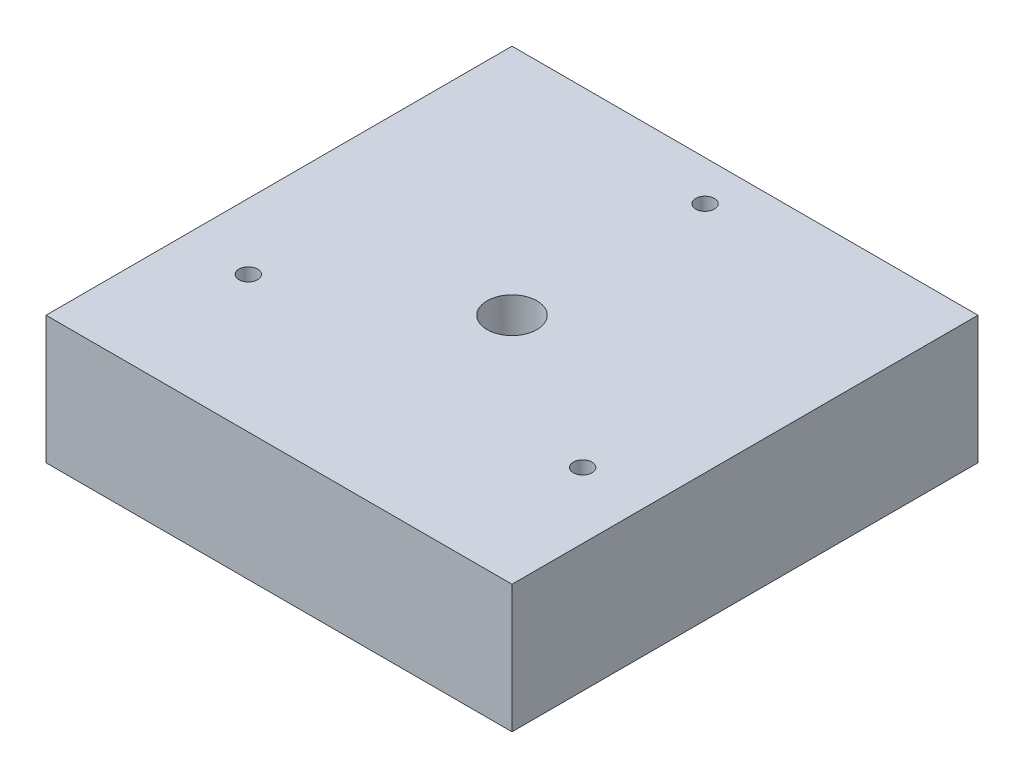
ISO-10303-21;
HEADER;
FILE_DESCRIPTION(('STEP AP214'),'2;1');
FILE_NAME('part.step','',(''),(''),'','','');
FILE_SCHEMA(('AUTOMOTIVE_DESIGN { 1 0 10303 214 1 1 1 1 }'));
ENDSEC;
DATA;
#1=APPLICATION_CONTEXT('core data for automotive mechanical design processes');
#2=APPLICATION_PROTOCOL_DEFINITION('international standard','automotive_design',2000,#1);
#3=PRODUCT_CONTEXT('',#1,'mechanical');
#4=PRODUCT('Part','Part','',(#3));
#5=PRODUCT_RELATED_PRODUCT_CATEGORY('part','',(#4));
#6=PRODUCT_DEFINITION_FORMATION('','',#4);
#7=PRODUCT_DEFINITION_CONTEXT('part definition',#1,'design');
#8=PRODUCT_DEFINITION('design','',#6,#7);
#9=PRODUCT_DEFINITION_SHAPE('','',#8);
#10=(LENGTH_UNIT() NAMED_UNIT(*) SI_UNIT(.MILLI.,.METRE.));
#11=(NAMED_UNIT(*) PLANE_ANGLE_UNIT() SI_UNIT($,.RADIAN.));
#12=(NAMED_UNIT(*) SI_UNIT($,.STERADIAN.) SOLID_ANGLE_UNIT());
#13=UNCERTAINTY_MEASURE_WITH_UNIT(LENGTH_MEASURE(1.E-05),#10,'distance_accuracy_value','');
#14=(GEOMETRIC_REPRESENTATION_CONTEXT(3) GLOBAL_UNCERTAINTY_ASSIGNED_CONTEXT((#13)) GLOBAL_UNIT_ASSIGNED_CONTEXT((#10,
#11,#12)) REPRESENTATION_CONTEXT('',''));
#15=CARTESIAN_POINT('',(0.,0.,0.));
#16=DIRECTION('',(0.,0.,1.));
#17=DIRECTION('',(1.,0.,0.));
#18=AXIS2_PLACEMENT_3D('',#15,#16,#17);
#19=CARTESIAN_POINT('',(0.,3.937,0.));
#20=DIRECTION('',(0.,-1.,0.));
#21=DIRECTION('',(0.,0.,-1.));
#22=AXIS2_PLACEMENT_3D('',#19,#20,#21);
#23=PLANE('',#22);
#24=CARTESIAN_POINT('',(15.9478578106904,3.937,9.2075));
#25=DIRECTION('',(0.,1.,0.));
#26=DIRECTION('',(0.,0.,1.));
#27=AXIS2_PLACEMENT_3D('',#24,#25,#26);
#28=CIRCLE('',#27,0.888999999999987);
#29=CARTESIAN_POINT('',(15.9478578106904,3.937,10.0965));
#30=VERTEX_POINT('',#29);
#31=EDGE_CURVE('E104',#30,#30,#28,.T.);
#32=ORIENTED_EDGE('',*,*,#31,.F.);
#33=EDGE_LOOP('',(#32));
#34=FACE_BOUND('',#33,.T.);
#35=CARTESIAN_POINT('',(-15.9478578106904,3.937,9.2075));
#36=DIRECTION('',(0.,1.,0.));
#37=DIRECTION('',(0.,0.,1.));
#38=AXIS2_PLACEMENT_3D('',#35,#36,#37);
#39=CIRCLE('',#38,0.888999999999989);
#40=CARTESIAN_POINT('',(-15.9478578106904,3.937,10.0965));
#41=VERTEX_POINT('',#40);
#42=EDGE_CURVE('E103',#41,#41,#39,.T.);
#43=ORIENTED_EDGE('',*,*,#42,.F.);
#44=EDGE_LOOP('',(#43));
#45=FACE_BOUND('',#44,.T.);
#46=CARTESIAN_POINT('',(0.,3.937,-18.415));
#47=DIRECTION('',(0.,1.,0.));
#48=DIRECTION('',(0.,0.,1.));
#49=AXIS2_PLACEMENT_3D('',#46,#47,#48);
#50=CIRCLE('',#49,0.888999999999989);
#51=CARTESIAN_POINT('',(0.,3.937,-17.526));
#52=VERTEX_POINT('',#51);
#53=EDGE_CURVE('E114',#52,#52,#50,.T.);
#54=ORIENTED_EDGE('',*,*,#53,.F.);
#55=EDGE_LOOP('',(#54));
#56=FACE_BOUND('',#55,.T.);
#57=DIRECTION('',(0.,0.,-1.));
#58=VECTOR('',#57,1.);
#59=CARTESIAN_POINT('',(22.225,3.937,22.225));
#60=LINE('',#59,#58);
#61=CARTESIAN_POINT('',(22.225,3.937,22.225));
#62=VERTEX_POINT('',#61);
#63=CARTESIAN_POINT('',(22.225,3.937,-22.225));
#64=VERTEX_POINT('',#63);
#65=EDGE_CURVE('E139',#62,#64,#60,.T.);
#66=ORIENTED_EDGE('',*,*,#65,.T.);
#67=DIRECTION('',(-1.,0.,0.));
#68=VECTOR('',#67,1.);
#69=CARTESIAN_POINT('',(-22.225,3.937,-22.225));
#70=LINE('',#69,#68);
#71=CARTESIAN_POINT('',(-22.225,3.937,-22.225));
#72=VERTEX_POINT('',#71);
#73=EDGE_CURVE('E141',#64,#72,#70,.T.);
#74=ORIENTED_EDGE('',*,*,#73,.T.);
#75=DIRECTION('',(0.,0.,1.));
#76=VECTOR('',#75,1.);
#77=CARTESIAN_POINT('',(-22.225,3.937,22.225));
#78=LINE('',#77,#76);
#79=CARTESIAN_POINT('',(-22.225,3.937,22.225));
#80=VERTEX_POINT('',#79);
#81=EDGE_CURVE('E66',#72,#80,#78,.T.);
#82=ORIENTED_EDGE('',*,*,#81,.T.);
#83=DIRECTION('',(1.,0.,0.));
#84=VECTOR('',#83,1.);
#85=CARTESIAN_POINT('',(-22.225,3.937,22.225));
#86=LINE('',#85,#84);
#87=EDGE_CURVE('E61',#80,#62,#86,.T.);
#88=ORIENTED_EDGE('',*,*,#87,.T.);
#89=EDGE_LOOP('',(#66,#74,#82,#88));
#90=FACE_BOUND('',#89,.T.);
#91=CARTESIAN_POINT('',(0.,3.937,0.));
#92=DIRECTION('',(0.,1.,0.));
#93=DIRECTION('',(0.,0.,1.));
#94=AXIS2_PLACEMENT_3D('',#91,#92,#93);
#95=CIRCLE('',#94,2.38125);
#96=CARTESIAN_POINT('',(0.,3.937,2.38125));
#97=VERTEX_POINT('',#96);
#98=EDGE_CURVE('E134',#97,#97,#95,.T.);
#99=ORIENTED_EDGE('',*,*,#98,.F.);
#100=EDGE_LOOP('',(#99));
#101=FACE_BOUND('',#100,.T.);
#102=ADVANCED_FACE('F46',(#34,#45,#56,#90,#101),#23,.F.);
#103=CARTESIAN_POINT('',(22.225,3.937,22.225));
#104=DIRECTION('',(-1.,0.,0.));
#105=DIRECTION('',(0.,0.,1.));
#106=AXIS2_PLACEMENT_3D('',#103,#104,#105);
#107=PLANE('',#106);
#108=DIRECTION('',(0.,-1.,0.));
#109=VECTOR('',#108,1.);
#110=CARTESIAN_POINT('',(22.225,3.937,22.225));
#111=LINE('',#110,#109);
#112=CARTESIAN_POINT('',(22.225,-8.255,22.225));
#113=VERTEX_POINT('',#112);
#114=EDGE_CURVE('E145',#62,#113,#111,.T.);
#115=ORIENTED_EDGE('',*,*,#114,.T.);
#116=DIRECTION('',(0.,0.,1.));
#117=VECTOR('',#116,1.);
#118=CARTESIAN_POINT('',(22.225,-8.255,-22.225));
#119=LINE('',#118,#117);
#120=CARTESIAN_POINT('',(22.225,-8.255,-22.225));
#121=VERTEX_POINT('',#120);
#122=EDGE_CURVE('E123',#121,#113,#119,.T.);
#123=ORIENTED_EDGE('',*,*,#122,.F.);
#124=DIRECTION('',(0.,-1.,0.));
#125=VECTOR('',#124,1.);
#126=CARTESIAN_POINT('',(22.225,3.937,-22.225));
#127=LINE('',#126,#125);
#128=EDGE_CURVE('E12',#64,#121,#127,.T.);
#129=ORIENTED_EDGE('',*,*,#128,.F.);
#130=ORIENTED_EDGE('',*,*,#65,.F.);
#131=EDGE_LOOP('',(#115,#123,#129,#130));
#132=FACE_BOUND('',#131,.T.);
#133=ADVANCED_FACE('F48',(#132),#107,.F.);
#134=CARTESIAN_POINT('',(-22.225,3.937,-22.225));
#135=DIRECTION('',(0.,0.,1.));
#136=DIRECTION('',(1.,0.,0.));
#137=AXIS2_PLACEMENT_3D('',#134,#135,#136);
#138=PLANE('',#137);
#139=ORIENTED_EDGE('',*,*,#128,.T.);
#140=DIRECTION('',(1.,0.,0.));
#141=VECTOR('',#140,1.);
#142=CARTESIAN_POINT('',(-22.225,-8.255,-22.225));
#143=LINE('',#142,#141);
#144=CARTESIAN_POINT('',(-22.225,-8.255,-22.225));
#145=VERTEX_POINT('',#144);
#146=EDGE_CURVE('E132',#145,#121,#143,.T.);
#147=ORIENTED_EDGE('',*,*,#146,.F.);
#148=DIRECTION('',(0.,-1.,0.));
#149=VECTOR('',#148,1.);
#150=CARTESIAN_POINT('',(-22.225,3.937,-22.225));
#151=LINE('',#150,#149);
#152=EDGE_CURVE('E54',#72,#145,#151,.T.);
#153=ORIENTED_EDGE('',*,*,#152,.F.);
#154=ORIENTED_EDGE('',*,*,#73,.F.);
#155=EDGE_LOOP('',(#139,#147,#153,#154));
#156=FACE_BOUND('',#155,.T.);
#157=ADVANCED_FACE('F159',(#156),#138,.F.);
#158=CARTESIAN_POINT('',(-22.225,3.937,22.225));
#159=DIRECTION('',(1.,0.,0.));
#160=DIRECTION('',(0.,0.,-1.));
#161=AXIS2_PLACEMENT_3D('',#158,#159,#160);
#162=PLANE('',#161);
#163=ORIENTED_EDGE('',*,*,#152,.T.);
#164=DIRECTION('',(0.,0.,-1.));
#165=VECTOR('',#164,1.);
#166=CARTESIAN_POINT('',(-22.225,-8.255,-22.225));
#167=LINE('',#166,#165);
#168=CARTESIAN_POINT('',(-22.225,-8.255,22.225));
#169=VERTEX_POINT('',#168);
#170=EDGE_CURVE('E129',#169,#145,#167,.T.);
#171=ORIENTED_EDGE('',*,*,#170,.F.);
#172=DIRECTION('',(0.,-1.,0.));
#173=VECTOR('',#172,1.);
#174=CARTESIAN_POINT('',(-22.225,3.937,22.225));
#175=LINE('',#174,#173);
#176=EDGE_CURVE('E147',#80,#169,#175,.T.);
#177=ORIENTED_EDGE('',*,*,#176,.F.);
#178=ORIENTED_EDGE('',*,*,#81,.F.);
#179=EDGE_LOOP('',(#163,#171,#177,#178));
#180=FACE_BOUND('',#179,.T.);
#181=ADVANCED_FACE('F151',(#180),#162,.F.);
#182=CARTESIAN_POINT('',(-22.225,3.937,22.225));
#183=DIRECTION('',(0.,0.,-1.));
#184=DIRECTION('',(-1.,0.,0.));
#185=AXIS2_PLACEMENT_3D('',#182,#183,#184);
#186=PLANE('',#185);
#187=ORIENTED_EDGE('',*,*,#176,.T.);
#188=DIRECTION('',(-1.,0.,0.));
#189=VECTOR('',#188,1.);
#190=CARTESIAN_POINT('',(-22.225,-8.255,22.225));
#191=LINE('',#190,#189);
#192=EDGE_CURVE('E126',#113,#169,#191,.T.);
#193=ORIENTED_EDGE('',*,*,#192,.F.);
#194=ORIENTED_EDGE('',*,*,#114,.F.);
#195=ORIENTED_EDGE('',*,*,#87,.F.);
#196=EDGE_LOOP('',(#187,#193,#194,#195));
#197=FACE_BOUND('',#196,.T.);
#198=ADVANCED_FACE('F164',(#197),#186,.F.);
#199=CARTESIAN_POINT('',(0.,3.937,0.));
#200=DIRECTION('',(0.,-1.,0.));
#201=DIRECTION('',(0.,0.,-1.));
#202=AXIS2_PLACEMENT_3D('',#199,#200,#201);
#203=CYLINDRICAL_SURFACE('',#202,2.38125);
#204=ORIENTED_EDGE('',*,*,#98,.T.);
#205=EDGE_LOOP('',(#204));
#206=FACE_BOUND('',#205,.T.);
#207=CARTESIAN_POINT('',(0.,-8.255,0.));
#208=DIRECTION('',(0.,-1.,0.));
#209=DIRECTION('',(0.,0.,-1.));
#210=AXIS2_PLACEMENT_3D('',#207,#208,#209);
#211=CIRCLE('',#210,2.38125);
#212=CARTESIAN_POINT('',(0.,-8.255,-2.38125));
#213=VERTEX_POINT('',#212);
#214=EDGE_CURVE('E120',#213,#213,#211,.T.);
#215=ORIENTED_EDGE('',*,*,#214,.T.);
#216=EDGE_LOOP('',(#215));
#217=FACE_BOUND('',#216,.T.);
#218=ADVANCED_FACE('F166',(#206,#217),#203,.F.);
#219=CARTESIAN_POINT('',(0.,-8.255,0.));
#220=DIRECTION('',(0.,1.,0.));
#221=DIRECTION('',(0.,0.,1.));
#222=AXIS2_PLACEMENT_3D('',#219,#220,#221);
#223=PLANE('',#222);
#224=ORIENTED_EDGE('',*,*,#122,.T.);
#225=ORIENTED_EDGE('',*,*,#192,.T.);
#226=ORIENTED_EDGE('',*,*,#170,.T.);
#227=ORIENTED_EDGE('',*,*,#146,.T.);
#228=EDGE_LOOP('',(#224,#225,#226,#227));
#229=FACE_BOUND('',#228,.T.);
#230=ORIENTED_EDGE('',*,*,#214,.F.);
#231=EDGE_LOOP('',(#230));
#232=FACE_BOUND('',#231,.T.);
#233=ADVANCED_FACE('F155',(#229,#232),#223,.F.);
#234=CARTESIAN_POINT('',(0.,-2.413,-18.415));
#235=DIRECTION('',(0.,1.,0.));
#236=DIRECTION('',(0.,0.,1.));
#237=AXIS2_PLACEMENT_3D('',#234,#235,#236);
#238=CONICAL_SURFACE('',#237,0.888999999999999,1.02974425867665);
#239=CARTESIAN_POINT('',(0.,-2.9471650903155,-18.415));
#240=VERTEX_POINT('',#239);
#241=VERTEX_LOOP('',#240);
#242=FACE_BOUND('',#241,.T.);
#243=CARTESIAN_POINT('',(0.,-2.413,-18.415));
#244=DIRECTION('',(0.,1.,0.));
#245=DIRECTION('',(0.,0.,1.));
#246=AXIS2_PLACEMENT_3D('',#243,#244,#245);
#247=CIRCLE('',#246,0.888999999999999);
#248=CARTESIAN_POINT('',(0.,-2.413,-17.526));
#249=VERTEX_POINT('',#248);
#250=EDGE_CURVE('E117',#249,#249,#247,.T.);
#251=ORIENTED_EDGE('',*,*,#250,.T.);
#252=EDGE_LOOP('',(#251));
#253=FACE_BOUND('',#252,.T.);
#254=ADVANCED_FACE('F186',(#242,#253),#238,.F.);
#255=CARTESIAN_POINT('',(0.,3.937,-18.415));
#256=DIRECTION('',(0.,1.,0.));
#257=DIRECTION('',(0.,0.,1.));
#258=AXIS2_PLACEMENT_3D('',#255,#256,#257);
#259=CYLINDRICAL_SURFACE('',#258,0.888999999999994);
#260=ORIENTED_EDGE('',*,*,#250,.F.);
#261=EDGE_LOOP('',(#260));
#262=FACE_BOUND('',#261,.T.);
#263=ORIENTED_EDGE('',*,*,#53,.T.);
#264=EDGE_LOOP('',(#263));
#265=FACE_BOUND('',#264,.T.);
#266=ADVANCED_FACE('F189',(#262,#265),#259,.F.);
#267=CARTESIAN_POINT('',(-15.9478578106904,-2.413,9.2075));
#268=DIRECTION('',(0.,1.,0.));
#269=DIRECTION('',(0.,0.,1.));
#270=AXIS2_PLACEMENT_3D('',#267,#268,#269);
#271=CONICAL_SURFACE('',#270,0.888999999999999,1.02974425867665);
#272=CARTESIAN_POINT('',(-15.9478578106904,-2.9471650903155,9.2075));
#273=VERTEX_POINT('',#272);
#274=VERTEX_LOOP('',#273);
#275=FACE_BOUND('',#274,.T.);
#276=CARTESIAN_POINT('',(-15.9478578106904,-2.413,9.2075));
#277=DIRECTION('',(0.,1.,0.));
#278=DIRECTION('',(0.,0.,1.));
#279=AXIS2_PLACEMENT_3D('',#276,#277,#278);
#280=CIRCLE('',#279,0.888999999999999);
#281=CARTESIAN_POINT('',(-15.9478578106904,-2.413,10.0965));
#282=VERTEX_POINT('',#281);
#283=EDGE_CURVE('E107',#282,#282,#280,.T.);
#284=ORIENTED_EDGE('',*,*,#283,.T.);
#285=EDGE_LOOP('',(#284));
#286=FACE_BOUND('',#285,.T.);
#287=ADVANCED_FACE('F193',(#275,#286),#271,.F.);
#288=CARTESIAN_POINT('',(-15.9478578106904,3.937,9.2075));
#289=DIRECTION('',(0.,1.,0.));
#290=DIRECTION('',(0.,0.,1.));
#291=AXIS2_PLACEMENT_3D('',#288,#289,#290);
#292=CYLINDRICAL_SURFACE('',#291,0.888999999999994);
#293=ORIENTED_EDGE('',*,*,#283,.F.);
#294=EDGE_LOOP('',(#293));
#295=FACE_BOUND('',#294,.T.);
#296=ORIENTED_EDGE('',*,*,#42,.T.);
#297=EDGE_LOOP('',(#296));
#298=FACE_BOUND('',#297,.T.);
#299=ADVANCED_FACE('F97',(#295,#298),#292,.F.);
#300=CARTESIAN_POINT('',(15.9478578106904,-2.413,9.2075));
#301=DIRECTION('',(0.,1.,0.));
#302=DIRECTION('',(0.,0.,1.));
#303=AXIS2_PLACEMENT_3D('',#300,#301,#302);
#304=CONICAL_SURFACE('',#303,0.888999999999997,1.02974425867665);
#305=CARTESIAN_POINT('',(15.9478578106904,-2.9471650903155,9.2075));
#306=VERTEX_POINT('',#305);
#307=VERTEX_LOOP('',#306);
#308=FACE_BOUND('',#307,.T.);
#309=CARTESIAN_POINT('',(15.9478578106904,-2.413,9.2075));
#310=DIRECTION('',(0.,1.,0.));
#311=DIRECTION('',(0.,0.,1.));
#312=AXIS2_PLACEMENT_3D('',#309,#310,#311);
#313=CIRCLE('',#312,0.888999999999997);
#314=CARTESIAN_POINT('',(15.9478578106904,-2.413,10.0965));
#315=VERTEX_POINT('',#314);
#316=EDGE_CURVE('E101',#315,#315,#313,.T.);
#317=ORIENTED_EDGE('',*,*,#316,.T.);
#318=EDGE_LOOP('',(#317));
#319=FACE_BOUND('',#318,.T.);
#320=ADVANCED_FACE('F93',(#308,#319),#304,.F.);
#321=CARTESIAN_POINT('',(15.9478578106904,3.937,9.2075));
#322=DIRECTION('',(0.,1.,0.));
#323=DIRECTION('',(0.,0.,1.));
#324=AXIS2_PLACEMENT_3D('',#321,#322,#323);
#325=CYLINDRICAL_SURFACE('',#324,0.888999999999992);
#326=ORIENTED_EDGE('',*,*,#316,.F.);
#327=EDGE_LOOP('',(#326));
#328=FACE_BOUND('',#327,.T.);
#329=ORIENTED_EDGE('',*,*,#31,.T.);
#330=EDGE_LOOP('',(#329));
#331=FACE_BOUND('',#330,.T.);
#332=ADVANCED_FACE('F96',(#328,#331),#325,.F.);
#333=CLOSED_SHELL('',(#102,#133,#157,#181,#198,#218,#233,#254,#266,#287,#299,#320,#332));
#334=MANIFOLD_SOLID_BREP('B2',#333);
#335=ADVANCED_BREP_SHAPE_REPRESENTATION('',(#18,#334),#14);
#336=SHAPE_DEFINITION_REPRESENTATION(#9,#335);
ENDSEC;
END-ISO-10303-21;
